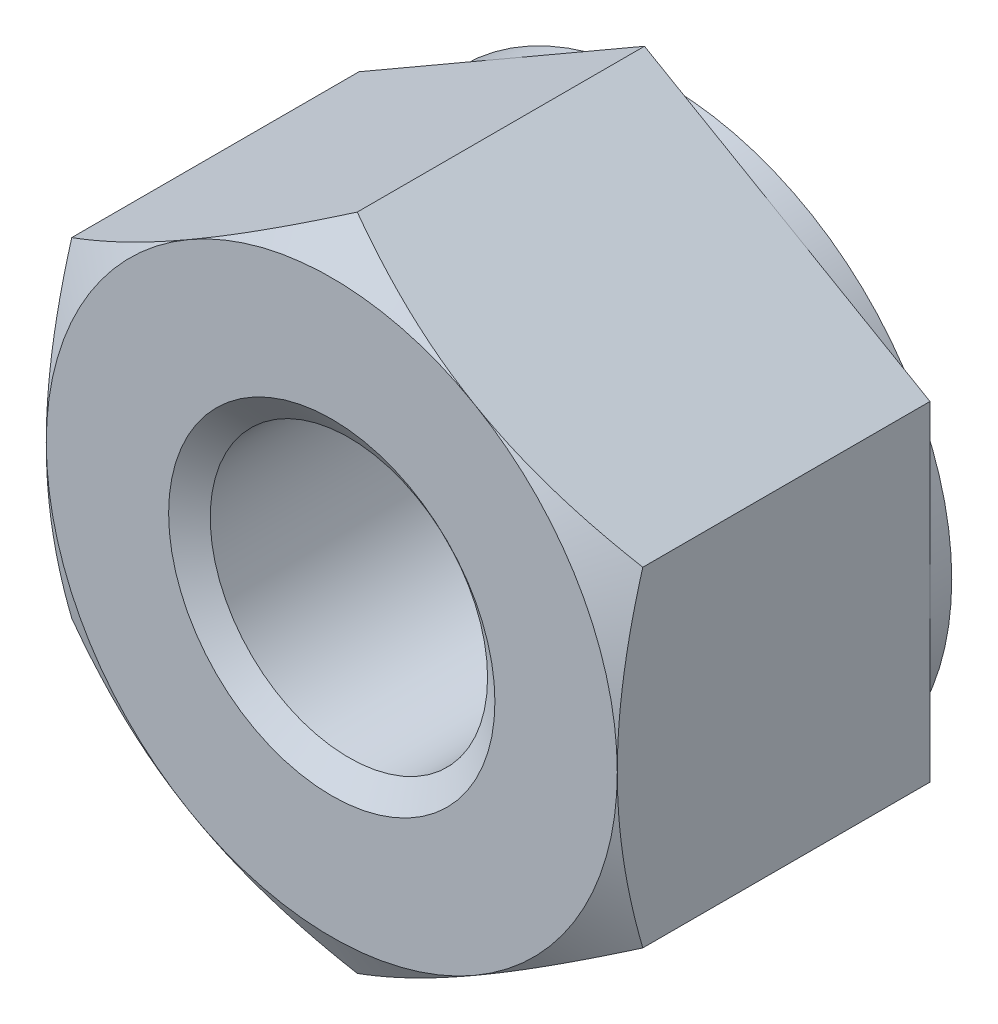
ISO-10303-21;
HEADER;
FILE_DESCRIPTION(('STEP AP214'),'2;1');
FILE_NAME('part.step','',(''),(''),'','','');
FILE_SCHEMA(('AUTOMOTIVE_DESIGN { 1 0 10303 214 1 1 1 1 }'));
ENDSEC;
DATA;
#1=APPLICATION_CONTEXT('core data for automotive mechanical design processes');
#2=APPLICATION_PROTOCOL_DEFINITION('international standard','automotive_design',2000,#1);
#3=PRODUCT_CONTEXT('',#1,'mechanical');
#4=PRODUCT('Part','Part','',(#3));
#5=PRODUCT_RELATED_PRODUCT_CATEGORY('part','',(#4));
#6=PRODUCT_DEFINITION_FORMATION('','',#4);
#7=PRODUCT_DEFINITION_CONTEXT('part definition',#1,'design');
#8=PRODUCT_DEFINITION('design','',#6,#7);
#9=PRODUCT_DEFINITION_SHAPE('','',#8);
#10=(LENGTH_UNIT() NAMED_UNIT(*) SI_UNIT(.MILLI.,.METRE.));
#11=(NAMED_UNIT(*) PLANE_ANGLE_UNIT() SI_UNIT($,.RADIAN.));
#12=(NAMED_UNIT(*) SI_UNIT($,.STERADIAN.) SOLID_ANGLE_UNIT());
#13=UNCERTAINTY_MEASURE_WITH_UNIT(LENGTH_MEASURE(1.E-05),#10,'distance_accuracy_value','');
#14=(GEOMETRIC_REPRESENTATION_CONTEXT(3) GLOBAL_UNCERTAINTY_ASSIGNED_CONTEXT((#13)) GLOBAL_UNIT_ASSIGNED_CONTEXT((#10,
#11,#12)) REPRESENTATION_CONTEXT('',''));
#15=CARTESIAN_POINT('',(0.,0.,0.));
#16=DIRECTION('',(0.,0.,1.));
#17=DIRECTION('',(1.,0.,0.));
#18=AXIS2_PLACEMENT_3D('',#15,#16,#17);
#19=CARTESIAN_POINT('',(0.,22.1243556529822,-11.5));
#20=DIRECTION('',(0.,0.,-1.));
#21=DIRECTION('',(-1.,0.,0.));
#22=AXIS2_PLACEMENT_3D('',#19,#20,#21);
#23=PLANE('',#22);
#24=CARTESIAN_POINT('',(0.,0.,-11.5));
#25=DIRECTION('',(0.,0.,1.));
#26=DIRECTION('',(1.,0.,0.));
#27=AXIS2_PLACEMENT_3D('',#24,#25,#26);
#28=CIRCLE('',#27,10.5);
#29=CARTESIAN_POINT('',(5.25000000000003,9.09326673973659,-11.5));
#30=VERTEX_POINT('',#29);
#31=CARTESIAN_POINT('',(10.5,0.,-11.5));
#32=VERTEX_POINT('',#31);
#33=EDGE_CURVE('E87',#30,#32,#28,.F.);
#34=ORIENTED_EDGE('',*,*,#33,.F.);
#35=DIRECTION('',(-0.866025403784437,0.500000000000003,0.));
#36=VECTOR('',#35,1.);
#37=CARTESIAN_POINT('',(10.5,6.06217782649105,-11.5));
#38=LINE('',#37,#36);
#39=CARTESIAN_POINT('',(10.5,6.06217782649108,-11.5));
#40=VERTEX_POINT('',#39);
#41=EDGE_CURVE('E364',#40,#30,#38,.T.);
#42=ORIENTED_EDGE('',*,*,#41,.F.);
#43=DIRECTION('',(0.,1.,0.));
#44=VECTOR('',#43,1.);
#45=CARTESIAN_POINT('',(10.5,6.06217782649105,-11.5));
#46=LINE('',#45,#44);
#47=EDGE_CURVE('E130',#40,#32,#46,.F.);
#48=ORIENTED_EDGE('',*,*,#47,.T.);
#49=EDGE_LOOP('',(#34,#42,#48));
#50=FACE_BOUND('',#49,.T.);
#51=ADVANCED_FACE('F17',(#50),#23,.T.);
#52=CARTESIAN_POINT('',(0.,22.1243556529822,-11.5));
#53=DIRECTION('',(0.,0.,-1.));
#54=DIRECTION('',(-1.,0.,0.));
#55=AXIS2_PLACEMENT_3D('',#52,#53,#54);
#56=PLANE('',#55);
#57=DIRECTION('',(-0.866025403784437,-0.500000000000003,0.));
#58=VECTOR('',#57,1.);
#59=CARTESIAN_POINT('',(0.,12.1243556529822,-11.5));
#60=LINE('',#59,#58);
#61=CARTESIAN_POINT('',(0.,12.1243556529822,-11.5));
#62=VERTEX_POINT('',#61);
#63=CARTESIAN_POINT('',(-5.25000000000003,9.09326673973659,-11.5));
#64=VERTEX_POINT('',#63);
#65=EDGE_CURVE('E343',#62,#64,#60,.T.);
#66=ORIENTED_EDGE('',*,*,#65,.F.);
#67=DIRECTION('',(-0.866025403784437,0.500000000000003,0.));
#68=VECTOR('',#67,1.);
#69=CARTESIAN_POINT('',(10.5,6.06217782649105,-11.5));
#70=LINE('',#69,#68);
#71=EDGE_CURVE('E345',#30,#62,#70,.T.);
#72=ORIENTED_EDGE('',*,*,#71,.F.);
#73=CARTESIAN_POINT('',(0.,0.,-11.5));
#74=DIRECTION('',(0.,0.,1.));
#75=DIRECTION('',(1.,0.,0.));
#76=AXIS2_PLACEMENT_3D('',#73,#74,#75);
#77=CIRCLE('',#76,10.5);
#78=EDGE_CURVE('E127',#64,#30,#77,.F.);
#79=ORIENTED_EDGE('',*,*,#78,.F.);
#80=EDGE_LOOP('',(#66,#72,#79));
#81=FACE_BOUND('',#80,.T.);
#82=ADVANCED_FACE('F330',(#81),#56,.T.);
#83=CARTESIAN_POINT('',(0.,22.1243556529822,-11.5));
#84=DIRECTION('',(0.,0.,-1.));
#85=DIRECTION('',(-1.,0.,0.));
#86=AXIS2_PLACEMENT_3D('',#83,#84,#85);
#87=PLANE('',#86);
#88=DIRECTION('',(0.,1.,0.));
#89=VECTOR('',#88,1.);
#90=CARTESIAN_POINT('',(-10.5,6.06217782649105,-11.5));
#91=LINE('',#90,#89);
#92=CARTESIAN_POINT('',(-10.5,6.06217782649105,-11.5));
#93=VERTEX_POINT('',#92);
#94=CARTESIAN_POINT('',(-10.5,0.,-11.5));
#95=VERTEX_POINT('',#94);
#96=EDGE_CURVE('E391',#93,#95,#91,.F.);
#97=ORIENTED_EDGE('',*,*,#96,.F.);
#98=DIRECTION('',(-0.866025403784437,-0.500000000000003,0.));
#99=VECTOR('',#98,1.);
#100=CARTESIAN_POINT('',(0.,12.1243556529822,-11.5));
#101=LINE('',#100,#99);
#102=EDGE_CURVE('E352',#64,#93,#101,.T.);
#103=ORIENTED_EDGE('',*,*,#102,.F.);
#104=CARTESIAN_POINT('',(0.,0.,-11.5));
#105=DIRECTION('',(0.,0.,1.));
#106=DIRECTION('',(1.,0.,0.));
#107=AXIS2_PLACEMENT_3D('',#104,#105,#106);
#108=CIRCLE('',#107,10.5);
#109=EDGE_CURVE('E123',#95,#64,#108,.F.);
#110=ORIENTED_EDGE('',*,*,#109,.F.);
#111=EDGE_LOOP('',(#97,#103,#110));
#112=FACE_BOUND('',#111,.T.);
#113=ADVANCED_FACE('F327',(#112),#87,.T.);
#114=CARTESIAN_POINT('',(0.,22.1243556529822,-11.5));
#115=DIRECTION('',(0.,0.,-1.));
#116=DIRECTION('',(-1.,0.,0.));
#117=AXIS2_PLACEMENT_3D('',#114,#115,#116);
#118=PLANE('',#117);
#119=CARTESIAN_POINT('',(0.,0.,-11.5));
#120=DIRECTION('',(0.,0.,1.));
#121=DIRECTION('',(1.,0.,0.));
#122=AXIS2_PLACEMENT_3D('',#119,#120,#121);
#123=CIRCLE('',#122,10.5);
#124=CARTESIAN_POINT('',(-5.25000000000005,-9.09326673973662,-11.5));
#125=VERTEX_POINT('',#124);
#126=EDGE_CURVE('E122',#125,#95,#123,.F.);
#127=ORIENTED_EDGE('',*,*,#126,.F.);
#128=DIRECTION('',(0.866025403784437,-0.500000000000003,0.));
#129=VECTOR('',#128,1.);
#130=CARTESIAN_POINT('',(-10.5,-6.06217782649112,-11.5));
#131=LINE('',#130,#129);
#132=CARTESIAN_POINT('',(-10.5,-6.06217782649112,-11.5));
#133=VERTEX_POINT('',#132);
#134=EDGE_CURVE('E383',#133,#125,#131,.T.);
#135=ORIENTED_EDGE('',*,*,#134,.F.);
#136=DIRECTION('',(0.,1.,0.));
#137=VECTOR('',#136,1.);
#138=CARTESIAN_POINT('',(-10.5,6.06217782649105,-11.5));
#139=LINE('',#138,#137);
#140=EDGE_CURVE('E388',#95,#133,#139,.F.);
#141=ORIENTED_EDGE('',*,*,#140,.F.);
#142=EDGE_LOOP('',(#127,#135,#141));
#143=FACE_BOUND('',#142,.T.);
#144=ADVANCED_FACE('F324',(#143),#118,.T.);
#145=CARTESIAN_POINT('',(0.,22.1243556529822,-11.5));
#146=DIRECTION('',(0.,0.,-1.));
#147=DIRECTION('',(-1.,0.,0.));
#148=AXIS2_PLACEMENT_3D('',#145,#146,#147);
#149=PLANE('',#148);
#150=CARTESIAN_POINT('',(0.,0.,-11.5));
#151=DIRECTION('',(0.,0.,1.));
#152=DIRECTION('',(1.,0.,0.));
#153=AXIS2_PLACEMENT_3D('',#150,#151,#152);
#154=CIRCLE('',#153,10.5);
#155=CARTESIAN_POINT('',(5.25000000000005,-9.09326673973662,-11.5));
#156=VERTEX_POINT('',#155);
#157=EDGE_CURVE('E94',#156,#125,#154,.F.);
#158=ORIENTED_EDGE('',*,*,#157,.F.);
#159=DIRECTION('',(0.866025403784437,0.500000000000003,0.));
#160=VECTOR('',#159,1.);
#161=CARTESIAN_POINT('',(0.,-12.1243556529822,-11.5));
#162=LINE('',#161,#160);
#163=CARTESIAN_POINT('',(0.,-12.1243556529823,-11.5));
#164=VERTEX_POINT('',#163);
#165=EDGE_CURVE('E108',#164,#156,#162,.T.);
#166=ORIENTED_EDGE('',*,*,#165,.F.);
#167=DIRECTION('',(0.866025403784437,-0.500000000000003,0.));
#168=VECTOR('',#167,1.);
#169=CARTESIAN_POINT('',(-10.5,-6.06217782649112,-11.5));
#170=LINE('',#169,#168);
#171=EDGE_CURVE('E120',#125,#164,#170,.T.);
#172=ORIENTED_EDGE('',*,*,#171,.F.);
#173=EDGE_LOOP('',(#158,#166,#172));
#174=FACE_BOUND('',#173,.T.);
#175=ADVANCED_FACE('F118',(#174),#149,.T.);
#176=CARTESIAN_POINT('',(0.,22.1243556529822,-11.5));
#177=DIRECTION('',(0.,0.,-1.));
#178=DIRECTION('',(-1.,0.,0.));
#179=AXIS2_PLACEMENT_3D('',#176,#177,#178);
#180=PLANE('',#179);
#181=DIRECTION('',(0.866025403784437,0.500000000000003,0.));
#182=VECTOR('',#181,1.);
#183=CARTESIAN_POINT('',(0.,-12.1243556529822,-11.5));
#184=LINE('',#183,#182);
#185=CARTESIAN_POINT('',(10.5,-6.06217782649112,-11.5));
#186=VERTEX_POINT('',#185);
#187=EDGE_CURVE('E99',#156,#186,#184,.T.);
#188=ORIENTED_EDGE('',*,*,#187,.F.);
#189=CARTESIAN_POINT('',(0.,0.,-11.5));
#190=DIRECTION('',(0.,0.,1.));
#191=DIRECTION('',(1.,0.,0.));
#192=AXIS2_PLACEMENT_3D('',#189,#190,#191);
#193=CIRCLE('',#192,10.5);
#194=EDGE_CURVE('E20',#32,#156,#193,.F.);
#195=ORIENTED_EDGE('',*,*,#194,.F.);
#196=DIRECTION('',(0.,1.,0.));
#197=VECTOR('',#196,1.);
#198=CARTESIAN_POINT('',(10.5,6.06217782649105,-11.5));
#199=LINE('',#198,#197);
#200=EDGE_CURVE('E104',#32,#186,#199,.F.);
#201=ORIENTED_EDGE('',*,*,#200,.T.);
#202=EDGE_LOOP('',(#188,#195,#201));
#203=FACE_BOUND('',#202,.T.);
#204=ADVANCED_FACE('F101',(#203),#180,.T.);
#205=CARTESIAN_POINT('',(0.,0.,0.));
#206=DIRECTION('',(0.,0.,1.));
#207=DIRECTION('',(1.,0.,0.));
#208=AXIS2_PLACEMENT_3D('',#205,#206,#207);
#209=CYLINDRICAL_SURFACE('',#208,10.5);
#210=ORIENTED_EDGE('',*,*,#78,.T.);
#211=ORIENTED_EDGE('',*,*,#33,.T.);
#212=ORIENTED_EDGE('',*,*,#194,.T.);
#213=ORIENTED_EDGE('',*,*,#157,.T.);
#214=ORIENTED_EDGE('',*,*,#126,.T.);
#215=ORIENTED_EDGE('',*,*,#109,.T.);
#216=EDGE_LOOP('',(#210,#211,#212,#213,#214,#215));
#217=FACE_BOUND('',#216,.T.);
#218=CARTESIAN_POINT('',(0.,0.,-12.3));
#219=DIRECTION('',(0.,0.,1.));
#220=DIRECTION('',(1.,0.,0.));
#221=AXIS2_PLACEMENT_3D('',#218,#219,#220);
#222=CIRCLE('',#221,10.5);
#223=CARTESIAN_POINT('',(10.5,0.,-12.3));
#224=VERTEX_POINT('',#223);
#225=EDGE_CURVE('E107',#224,#224,#222,.T.);
#226=ORIENTED_EDGE('',*,*,#225,.T.);
#227=EDGE_LOOP('',(#226));
#228=FACE_BOUND('',#227,.T.);
#229=ADVANCED_FACE('F91',(#217,#228),#209,.T.);
#230=CARTESIAN_POINT('',(10.5,6.06217782649105,-12.3));
#231=DIRECTION('',(-1.,0.,0.));
#232=DIRECTION('',(0.,0.,1.));
#233=AXIS2_PLACEMENT_3D('',#230,#231,#232);
#234=PLANE('',#233);
#235=DIRECTION('',(0.,0.,1.));
#236=VECTOR('',#235,1.);
#237=CARTESIAN_POINT('',(10.5,-6.06217782649112,-12.3));
#238=LINE('',#237,#236);
#239=CARTESIAN_POINT('',(10.5000000141308,-6.06217781833273,-0.937822180810799));
#240=VERTEX_POINT('',#239);
#241=EDGE_CURVE('E415',#186,#240,#238,.T.);
#242=ORIENTED_EDGE('',*,*,#241,.F.);
#243=ORIENTED_EDGE('',*,*,#200,.F.);
#244=ORIENTED_EDGE('',*,*,#47,.F.);
#245=DIRECTION('',(0.,0.,1.));
#246=VECTOR('',#245,1.);
#247=CARTESIAN_POINT('',(10.5,6.06217782649106,-12.3));
#248=LINE('',#247,#246);
#249=CARTESIAN_POINT('',(10.5,6.06217778282534,-0.937822163495314));
#250=VERTEX_POINT('',#249);
#251=EDGE_CURVE('E368',#250,#40,#248,.F.);
#252=ORIENTED_EDGE('',*,*,#251,.F.);
#253=CARTESIAN_POINT('',(10.5,0.,0.));
#254=CARTESIAN_POINT('',(10.5,0.2573053415855,4.3180546766502E-05));
#255=CARTESIAN_POINT('',(10.5,0.514598430492421,-0.00545942613173706));
#256=CARTESIAN_POINT('',(10.5,1.02867940975207,-0.0272364593957545));
#257=CARTESIAN_POINT('',(10.5,1.28546739002638,-0.0435087535011609));
#258=CARTESIAN_POINT('',(10.5,1.79687922123455,-0.0863982575084601));
#259=CARTESIAN_POINT('',(10.5,2.05150747513537,-0.112963388756823));
#260=CARTESIAN_POINT('',(10.5,2.55955197649249,-0.175871111296905));
#261=CARTESIAN_POINT('',(10.5,2.81296819186829,-0.212213959945566));
#262=CARTESIAN_POINT('',(10.5,3.31802004073705,-0.293936008682098));
#263=CARTESIAN_POINT('',(10.5,3.56965745147566,-0.339304270228194));
#264=CARTESIAN_POINT('',(10.5,4.07129355646224,-0.438331298687667));
#265=CARTESIAN_POINT('',(10.5,4.32129214987654,-0.491990570833481));
#266=CARTESIAN_POINT('',(10.5,5.07118387807468,-0.664785842113199));
#267=CARTESIAN_POINT('',(10.5,5.56849252099098,-0.795323180471177));
#268=CARTESIAN_POINT('',(10.5,6.06217773924323,-0.93782215091425));
#269=B_SPLINE_CURVE_WITH_KNOTS('',3,(#253,#254,#255,#256,#257,#258,#259,#260,#261,#262,#263,
#264,#265,#266,#267,#268),.UNSPECIFIED.,.F.,.F.,(4,2,2,2,2,2,2,4),(0.,0.771837534474387,
1.5435222849452,2.31135248440984,3.07920289572547,3.84612830249875,4.61310046213946,
6.15457742212395),.UNSPECIFIED.);
#270=CARTESIAN_POINT('',(10.5,0.,0.));
#271=VERTEX_POINT('',#270);
#272=EDGE_CURVE('E443',#271,#250,#269,.T.);
#273=ORIENTED_EDGE('',*,*,#272,.F.);
#274=CARTESIAN_POINT('',(10.5000000004793,-6.06217773924327,-0.937822150600452));
#275=CARTESIAN_POINT('',(10.5000000001177,-5.56849252094334,-0.795323180381678));
#276=CARTESIAN_POINT('',(10.5000000000215,-5.07118387802157,-0.664785842086106));
#277=CARTESIAN_POINT('',(10.4999999999893,-4.32129214983151,-0.491990570830493));
#278=CARTESIAN_POINT('',(10.4999999999971,-4.07129355642171,-0.438331298681078));
#279=CARTESIAN_POINT('',(10.5000000000029,-3.56965745144318,-0.339304270220368));
#280=CARTESIAN_POINT('',(10.5000000000008,-3.3180200407081,-0.293936008676617));
#281=CARTESIAN_POINT('',(10.4999999999992,-2.81296819184435,-0.21221395994249));
#282=CARTESIAN_POINT('',(10.4999999999998,-2.55955197647001,-0.175871111293979));
#283=CARTESIAN_POINT('',(10.5000000000002,-2.05150747511533,-0.112963388754485));
#284=CARTESIAN_POINT('',(10.5000000000001,-1.79687922121547,-0.0863982575065776));
#285=CARTESIAN_POINT('',(10.4999999999999,-1.28546739001095,-0.0435087535001499));
#286=CARTESIAN_POINT('',(10.5,-1.02867940973932,-0.0272364593950914));
#287=CARTESIAN_POINT('',(10.5,-0.514598430485708,-0.0054594261315764));
#288=CARTESIAN_POINT('',(10.5000000000001,-0.25730534158215,4.31805468005819E-05));
#289=CARTESIAN_POINT('',(10.5,0.,0.));
#290=B_SPLINE_CURVE_WITH_KNOTS('',3,(#274,#275,#276,#277,#278,#279,#280,#281,#282,#283,#284,
#285,#286,#287,#288,#289),.UNSPECIFIED.,.F.,.F.,(4,2,2,2,2,2,2,4),(0.,1.54147695995325,
2.30844911958364,3.07537452634494,3.84322493765628,4.61105513711786,5.3827398875806,
6.15457742204491),.UNSPECIFIED.);
#291=EDGE_CURVE('E133',#240,#271,#290,.T.);
#292=ORIENTED_EDGE('',*,*,#291,.F.);
#293=EDGE_LOOP('',(#242,#243,#244,#252,#273,#292));
#294=FACE_BOUND('',#293,.T.);
#295=ADVANCED_FACE('F146',(#294),#234,.F.);
#296=CARTESIAN_POINT('',(10.5,6.06217782649105,-12.3));
#297=DIRECTION('',(0.500000000000003,0.866025403784437,0.));
#298=DIRECTION('',(-0.866025403784437,0.500000000000003,0.));
#299=AXIS2_PLACEMENT_3D('',#296,#297,#298);
#300=PLANE('',#299);
#301=ORIENTED_EDGE('',*,*,#41,.T.);
#302=ORIENTED_EDGE('',*,*,#71,.T.);
#303=DIRECTION('',(0.,0.,1.));
#304=VECTOR('',#303,1.);
#305=CARTESIAN_POINT('',(0.,12.1243556529822,-12.3));
#306=LINE('',#305,#304);
#307=CARTESIAN_POINT('',(3.78156402024653E-08,12.1243556311493,-0.937822163495333));
#308=VERTEX_POINT('',#307);
#309=EDGE_CURVE('E353',#308,#62,#306,.F.);
#310=ORIENTED_EDGE('',*,*,#309,.F.);
#311=CARTESIAN_POINT('',(5.25000000000003,9.09326673973659,0.));
#312=CARTESIAN_POINT('',(5.02716703765755,9.22191941052934,4.31805467655264E-05));
#313=CARTESIAN_POINT('',(4.80434468644599,9.35056595498281,-0.00545942613173802));
#314=CARTESIAN_POINT('',(4.35913749880475,9.60760644461263,-0.0272364593957552));
#315=CARTESIAN_POINT('',(4.1367525845007,9.73600043474979,-0.0435087535011614));
#316=CARTESIAN_POINT('',(3.69385694687851,9.99170635035387,-0.0863982575084612));
#317=CARTESIAN_POINT('',(3.47334241047912,10.1190204773043,-0.112963388756825));
#318=CARTESIAN_POINT('',(3.03336296605086,10.3730427279828,-0.175871111296908));
#319=CARTESIAN_POINT('',(2.81389808580451,10.4997508356707,-0.212213959945568));
#320=CARTESIAN_POINT('',(2.37651035445586,10.7522767601051,-0.293936008682101));
#321=CARTESIAN_POINT('',(2.15858596421368,10.8780954654744,-0.339304270228198));
#322=CARTESIAN_POINT('',(1.72415635383983,11.1289135179677,-0.438331298687671));
#323=CARTESIAN_POINT('',(1.50765122103266,11.2539128146749,-0.491990570833486));
#324=CARTESIAN_POINT('',(0.85822593432526,11.628858678774,-0.664785842113205));
#325=CARTESIAN_POINT('',(0.427544016038181,11.8775130002321,-0.795323180471184));
#326=CARTESIAN_POINT('',(7.55588658482082E-08,12.1243556093582,-0.937822150914259));
#327=B_SPLINE_CURVE_WITH_KNOTS('',3,(#311,#312,#313,#314,#315,#316,#317,#318,#319,#320,#321,
#322,#323,#324,#325,#326),.UNSPECIFIED.,.F.,.F.,(4,2,2,2,2,2,2,4),(0.,0.77183753447439,
1.54352228494521,2.31135248440985,3.07920289572548,3.84612830249877,4.61310046213948,
6.15457742212398),.UNSPECIFIED.);
#328=CARTESIAN_POINT('',(5.25000000000003,9.09326673973659,0.));
#329=VERTEX_POINT('',#328);
#330=EDGE_CURVE('E233',#329,#308,#327,.T.);
#331=ORIENTED_EDGE('',*,*,#330,.F.);
#332=CARTESIAN_POINT('',(10.5000000041469,6.06217778132959,-0.93782220790423));
#333=CARTESIAN_POINT('',(10.0724560730786,6.30902041728449,-0.795323215553693));
#334=CARTESIAN_POINT('',(9.64177415101793,6.55767474950975,-0.664785868019314));
#335=CARTESIAN_POINT('',(8.99234885308478,6.93262062296021,-0.491990588962645));
#336=CARTESIAN_POINT('',(8.77584371569879,7.05761992161287,-0.438331315233156));
#337=CARTESIAN_POINT('',(8.34141409655094,7.30843797866079,-0.339304283385243));
#338=CARTESIAN_POINT('',(8.12348970211333,7.43425668663932,-0.293936020035769));
#339=CARTESIAN_POINT('',(7.686101962325,7.68678261608349,-0.212213968153186));
#340=CARTESIAN_POINT('',(7.46663707783506,7.81349072617129,-0.175871118155983));
#341=CARTESIAN_POINT('',(7.02665762492507,8.06751298170983,-0.112963393234373));
#342=CARTESIAN_POINT('',(6.80614308428768,8.19482711112025,-0.08639826095178));
#343=CARTESIAN_POINT('',(6.36324743797566,8.45053303175201,-0.0435087552512121));
#344=CARTESIAN_POINT('',(6.14086251921905,8.5789270244572,-0.0272364604953518));
#345=CARTESIAN_POINT('',(5.69565532260047,8.83596751926478,-0.00545942635481625));
#346=CARTESIAN_POINT('',(5.47283296686403,8.96461406632802,4.31805473506373E-05));
#347=CARTESIAN_POINT('',(5.25000000000003,9.09326673973659,0.));
#348=B_SPLINE_CURVE_WITH_KNOTS('',3,(#332,#333,#334,#335,#336,#337,#338,#339,#340,#341,#342,
#343,#344,#345,#346,#347),.UNSPECIFIED.,.F.,.F.,(4,2,2,2,2,2,2,4),(0.,1.54147699200857,
2.30844916707764,3.07537458940569,3.84322501575467,4.61105523015517,5.38273999612459,
6.15457754626661),.UNSPECIFIED.);
#349=EDGE_CURVE('E439',#250,#329,#348,.T.);
#350=ORIENTED_EDGE('',*,*,#349,.F.);
#351=ORIENTED_EDGE('',*,*,#251,.T.);
#352=EDGE_LOOP('',(#301,#302,#310,#331,#350,#351));
#353=FACE_BOUND('',#352,.T.);
#354=ADVANCED_FACE('F318',(#353),#300,.T.);
#355=CARTESIAN_POINT('',(0.,12.1243556529822,-12.3));
#356=DIRECTION('',(-0.500000000000003,0.866025403784437,0.));
#357=DIRECTION('',(-0.866025403784437,-0.500000000000003,0.));
#358=AXIS2_PLACEMENT_3D('',#355,#356,#357);
#359=PLANE('',#358);
#360=ORIENTED_EDGE('',*,*,#65,.T.);
#361=ORIENTED_EDGE('',*,*,#102,.T.);
#362=DIRECTION('',(0.,0.,1.));
#363=VECTOR('',#362,1.);
#364=CARTESIAN_POINT('',(-10.5,6.06217782649105,-12.3));
#365=LINE('',#364,#363);
#366=CARTESIAN_POINT('',(-10.5000000141308,6.06217781833265,-0.937822180810777));
#367=VERTEX_POINT('',#366);
#368=EDGE_CURVE('E355',#367,#93,#365,.F.);
#369=ORIENTED_EDGE('',*,*,#368,.F.);
#370=CARTESIAN_POINT('',(-5.25000000000003,9.09326673973659,0.));
#371=CARTESIAN_POINT('',(-5.47283296664209,8.96461406646147,4.31805499926728E-05));
#372=CARTESIAN_POINT('',(-5.69565532215222,8.83596751952623,-0.00545942634239283));
#373=CARTESIAN_POINT('',(-6.14086251836396,8.57892702494823,-0.027236460444095));
#374=CARTESIAN_POINT('',(-6.36324743693994,8.45053303234467,-0.0435087551730621));
#375=CARTESIAN_POINT('',(-6.80614308301272,8.19482711186163,-0.0863982608062398));
#376=CARTESIAN_POINT('',(-7.02665762359107,8.06751298249849,-0.112963393053632));
#377=CARTESIAN_POINT('',(-7.46663707632205,7.81349072702635,-0.175871117929668));
#378=CARTESIAN_POINT('',(-7.68610196069216,7.68678261695761,-0.21221396791529));
#379=CARTESIAN_POINT('',(-8.12348970020402,7.43425668781019,-0.293936019611922));
#380=CARTESIAN_POINT('',(-8.34141409448584,7.30843798010859,-0.339304282780156));
#381=CARTESIAN_POINT('',(-8.77584371287409,7.05761992298819,-0.438331314723622));
#382=CARTESIAN_POINT('',(-8.99234884965601,6.93262062398621,-0.491990588731326));
#383=CARTESIAN_POINT('',(-9.6417741482912,6.55767475300062,-0.664785865925144));
#384=CARTESIAN_POINT('',(-10.0724560744369,6.30902042700531,-0.795323208637138));
#385=CARTESIAN_POINT('',(-10.5000000226657,6.062177813405,-0.93782218365576));
#386=B_SPLINE_CURVE_WITH_KNOTS('',3,(#370,#371,#372,#373,#374,#375,#376,#377,#378,#379,#380,
#381,#382,#383,#384,#385),.UNSPECIFIED.,.F.,.F.,(4,2,2,2,2,2,2,4),(0.,0.771837549363267,
1.54352231470848,2.31135252887181,3.07920295488873,3.84612837629034,4.61310055056201,
6.15457754015559),.UNSPECIFIED.);
#387=CARTESIAN_POINT('',(-5.25000000000003,9.09326673973659,0.));
#388=VERTEX_POINT('',#387);
#389=EDGE_CURVE('E210',#388,#367,#386,.T.);
#390=ORIENTED_EDGE('',*,*,#389,.F.);
#391=CARTESIAN_POINT('',(4.11844570895324E-08,12.1243556339928,-0.937822207904265));
#392=CARTESIAN_POINT('',(-0.427543917823752,11.8775130464312,-0.795323215553722));
#393=CARTESIAN_POINT('',(-0.858225847322246,11.6288587270886,-0.664785868019336));
#394=CARTESIAN_POINT('',(-1.50765114774108,11.2539128579434,-0.491990588962659));
#395=CARTESIAN_POINT('',(-1.72415628452251,11.1289135582436,-0.438331315233168));
#396=CARTESIAN_POINT('',(-2.15858590322779,10.8780955004291,-0.339304283385252));
#397=CARTESIAN_POINT('',(-2.37651029782734,10.7522767927311,-0.293936020035779));
#398=CARTESIAN_POINT('',(-2.81389803773445,10.4997508634926,-0.212213968153194));
#399=CARTESIAN_POINT('',(-3.03336292218097,10.3730427533296,-0.175871118155989));
#400=CARTESIAN_POINT('',(-3.47334237505896,10.1190204977356,-0.112963393234376));
#401=CARTESIAN_POINT('',(-3.69385691570778,9.99170636834501,-0.0863982609517823));
#402=CARTESIAN_POINT('',(-4.13675256202899,9.73600044772915,-0.0435087552512133));
#403=CARTESIAN_POINT('',(-4.3591374807833,9.60760645501998,-0.0272364604953529));
#404=CARTESIAN_POINT('',(-4.80434467739729,9.35056596020442,-0.00545942635481708));
#405=CARTESIAN_POINT('',(-5.02716703313142,9.22191941313719,4.3180547350049E-05));
#406=CARTESIAN_POINT('',(-5.25000000000003,9.09326673973659,0.));
#407=B_SPLINE_CURVE_WITH_KNOTS('',3,(#391,#392,#393,#394,#395,#396,#397,#398,#399,#400,#401,
#402,#403,#404,#405,#406),.UNSPECIFIED.,.F.,.F.,(4,2,2,2,2,2,2,4),(0.,1.54147699200859,
2.30844916707768,3.07537458940574,3.84322501575473,4.61105523015524,5.38273999612468,
6.1545775462667),.UNSPECIFIED.);
#408=EDGE_CURVE('E228',#308,#388,#407,.T.);
#409=ORIENTED_EDGE('',*,*,#408,.F.);
#410=ORIENTED_EDGE('',*,*,#309,.T.);
#411=EDGE_LOOP('',(#360,#361,#369,#390,#409,#410));
#412=FACE_BOUND('',#411,.T.);
#413=ADVANCED_FACE('F219',(#412),#359,.T.);
#414=CARTESIAN_POINT('',(-10.5,6.06217782649105,-12.3));
#415=DIRECTION('',(-1.,0.,0.));
#416=DIRECTION('',(0.,0.,1.));
#417=AXIS2_PLACEMENT_3D('',#414,#415,#416);
#418=PLANE('',#417);
#419=ORIENTED_EDGE('',*,*,#96,.T.);
#420=ORIENTED_EDGE('',*,*,#140,.T.);
#421=DIRECTION('',(0.,0.,1.));
#422=VECTOR('',#421,1.);
#423=CARTESIAN_POINT('',(-10.5,-6.06217782649112,-12.3));
#424=LINE('',#423,#422);
#425=CARTESIAN_POINT('',(-10.5,-6.06217778282538,-0.937822163495334));
#426=VERTEX_POINT('',#425);
#427=EDGE_CURVE('E385',#426,#133,#424,.F.);
#428=ORIENTED_EDGE('',*,*,#427,.F.);
#429=CARTESIAN_POINT('',(-10.5,0.,0.));
#430=CARTESIAN_POINT('',(-10.5,-0.257305341585501,4.3180546766401E-05));
#431=CARTESIAN_POINT('',(-10.5,-0.514598430492423,-0.0054594261317371));
#432=CARTESIAN_POINT('',(-10.5,-1.02867940975207,-0.0272364593957544));
#433=CARTESIAN_POINT('',(-10.5,-1.28546739002639,-0.0435087535011608));
#434=CARTESIAN_POINT('',(-10.5,-1.79687922123455,-0.0863982575084603));
#435=CARTESIAN_POINT('',(-10.5,-2.05150747513538,-0.112963388756823));
#436=CARTESIAN_POINT('',(-10.5,-2.5595519764925,-0.175871111296906));
#437=CARTESIAN_POINT('',(-10.5,-2.8129681918683,-0.212213959945567));
#438=CARTESIAN_POINT('',(-10.5,-3.31802004073707,-0.2939360086821));
#439=CARTESIAN_POINT('',(-10.5,-3.56965745147568,-0.339304270228196));
#440=CARTESIAN_POINT('',(-10.5,-4.07129355646225,-0.438331298687669));
#441=CARTESIAN_POINT('',(-10.5,-4.32129214987656,-0.491990570833484));
#442=CARTESIAN_POINT('',(-10.5,-5.0711838780747,-0.664785842113205));
#443=CARTESIAN_POINT('',(-10.5,-5.568492520991,-0.795323180471185));
#444=CARTESIAN_POINT('',(-10.5,-6.06217773924325,-0.937822150914257));
#445=B_SPLINE_CURVE_WITH_KNOTS('',3,(#429,#430,#431,#432,#433,#434,#435,#436,#437,#438,#439,
#440,#441,#442,#443,#444),.UNSPECIFIED.,.F.,.F.,(4,2,2,2,2,2,2,4),(0.,0.771837534474389,
1.54352228494521,2.31135248440985,3.07920289572548,3.84612830249877,4.61310046213948,
6.15457742212398),.UNSPECIFIED.);
#446=CARTESIAN_POINT('',(-10.5,0.,0.));
#447=VERTEX_POINT('',#446);
#448=EDGE_CURVE('E205',#447,#426,#445,.T.);
#449=ORIENTED_EDGE('',*,*,#448,.F.);
#450=CARTESIAN_POINT('',(-10.5000000004793,6.0621777392432,-0.937822150600434));
#451=CARTESIAN_POINT('',(-10.5000000001177,5.56849252094327,-0.795323180381659));
#452=CARTESIAN_POINT('',(-10.5000000000215,5.0711838780215,-0.66478584208609));
#453=CARTESIAN_POINT('',(-10.4999999999893,4.32129214983145,-0.491990570830482));
#454=CARTESIAN_POINT('',(-10.4999999999971,4.07129355642166,-0.438331298681068));
#455=CARTESIAN_POINT('',(-10.5000000000029,3.56965745144313,-0.33930427022036));
#456=CARTESIAN_POINT('',(-10.5000000000008,3.31802004070806,-0.29393600867661));
#457=CARTESIAN_POINT('',(-10.4999999999992,2.81296819184432,-0.212213959942485));
#458=CARTESIAN_POINT('',(-10.4999999999998,2.55955197646998,-0.175871111293974));
#459=CARTESIAN_POINT('',(-10.5000000000002,2.05150747511531,-0.112963388754482));
#460=CARTESIAN_POINT('',(-10.5000000000001,1.79687922121545,-0.0863982575065748));
#461=CARTESIAN_POINT('',(-10.4999999999999,1.28546739001093,-0.0435087535001486));
#462=CARTESIAN_POINT('',(-10.5,1.0286794097393,-0.0272364593950908));
#463=CARTESIAN_POINT('',(-10.5,0.514598430485701,-0.00545942613157678));
#464=CARTESIAN_POINT('',(-10.5000000000001,0.257305341582147,4.31805468000881E-05));
#465=CARTESIAN_POINT('',(-10.5,0.,0.));
#466=B_SPLINE_CURVE_WITH_KNOTS('',3,(#450,#451,#452,#453,#454,#455,#456,#457,#458,#459,#460,
#461,#462,#463,#464,#465),.UNSPECIFIED.,.F.,.F.,(4,2,2,2,2,2,2,4),(0.,1.54147695995323,
2.30844911958362,3.0753745263449,3.84322493765623,4.6110551371178,5.38273988758053,
6.15457742204484),.UNSPECIFIED.);
#467=EDGE_CURVE('E223',#367,#447,#466,.T.);
#468=ORIENTED_EDGE('',*,*,#467,.F.);
#469=ORIENTED_EDGE('',*,*,#368,.T.);
#470=EDGE_LOOP('',(#419,#420,#428,#449,#468,#469));
#471=FACE_BOUND('',#470,.T.);
#472=ADVANCED_FACE('F216',(#471),#418,.T.);
#473=CARTESIAN_POINT('',(-10.5,-6.06217782649112,-12.3));
#474=DIRECTION('',(-0.500000000000003,-0.866025403784437,0.));
#475=DIRECTION('',(0.866025403784437,-0.500000000000003,0.));
#476=AXIS2_PLACEMENT_3D('',#473,#474,#475);
#477=PLANE('',#476);
#478=ORIENTED_EDGE('',*,*,#134,.T.);
#479=ORIENTED_EDGE('',*,*,#171,.T.);
#480=DIRECTION('',(0.,0.,1.));
#481=VECTOR('',#480,1.);
#482=CARTESIAN_POINT('',(0.,-12.1243556529823,-12.3));
#483=LINE('',#482,#481);
#484=CARTESIAN_POINT('',(-3.78157248753041E-08,-12.1243556311494,-0.937822163495373));
#485=VERTEX_POINT('',#484);
#486=EDGE_CURVE('E115',#485,#164,#483,.F.);
#487=ORIENTED_EDGE('',*,*,#486,.F.);
#488=CARTESIAN_POINT('',(-5.25000000000006,-9.09326673973665,0.));
#489=CARTESIAN_POINT('',(-5.02716703765759,-9.2219194105294,4.31805467297049E-05));
#490=CARTESIAN_POINT('',(-4.80434468644603,-9.35056595498286,-0.00545942613177378));
#491=CARTESIAN_POINT('',(-4.35913749880479,-9.60760644461268,-0.0272364593957913));
#492=CARTESIAN_POINT('',(-4.13675258450075,-9.73600043474984,-0.043508753501198));
#493=CARTESIAN_POINT('',(-3.69385694687856,-9.99170635035392,-0.0863982575084967));
#494=CARTESIAN_POINT('',(-3.47334241047917,-10.1190204773043,-0.112963388756859));
#495=CARTESIAN_POINT('',(-3.03336296605092,-10.3730427279829,-0.17587111129694));
#496=CARTESIAN_POINT('',(-2.81389808580457,-10.4997508356708,-0.212213959945599));
#497=CARTESIAN_POINT('',(-2.37651035445592,-10.7522767601052,-0.29393600868213));
#498=CARTESIAN_POINT('',(-2.15858596421375,-10.8780954654745,-0.339304270228226));
#499=CARTESIAN_POINT('',(-1.7241563538399,-11.1289135179678,-0.438331298687697));
#500=CARTESIAN_POINT('',(-1.50765122103274,-11.2539128146749,-0.491990570833509));
#501=CARTESIAN_POINT('',(-0.858225934325343,-11.628858678774,-0.664785842113224));
#502=CARTESIAN_POINT('',(-0.427544016038271,-11.8775130002321,-0.795323180471199));
#503=CARTESIAN_POINT('',(-7.55589586298844E-08,-12.1243556093583,-0.937822150914272));
#504=B_SPLINE_CURVE_WITH_KNOTS('',3,(#488,#489,#490,#491,#492,#493,#494,#495,#496,#497,#498,
#499,#500,#501,#502,#503),.UNSPECIFIED.,.F.,.F.,(4,2,2,2,2,2,2,4),(0.,0.771837534474382,
1.54352228494519,2.31135248440982,3.07920289572545,3.84612830249872,4.61310046213942,
6.1545774221239),.UNSPECIFIED.);
#505=CARTESIAN_POINT('',(-5.25000000000004,-9.09326673973662,0.));
#506=VERTEX_POINT('',#505);
#507=EDGE_CURVE('E179',#506,#485,#504,.T.);
#508=ORIENTED_EDGE('',*,*,#507,.F.);
#509=CARTESIAN_POINT('',(-10.5000000041469,-6.06217778132964,-0.937822207904268));
#510=CARTESIAN_POINT('',(-10.0724560730787,-6.30902041728455,-0.795323215553726));
#511=CARTESIAN_POINT('',(-9.64177415101796,-6.55767474950981,-0.664785868019346));
#512=CARTESIAN_POINT('',(-8.99234885308481,-6.93262062296028,-0.491990588962677));
#513=CARTESIAN_POINT('',(-8.77584371569881,-7.05761992161293,-0.438331315233188));
#514=CARTESIAN_POINT('',(-8.34141409655096,-7.30843797866085,-0.339304283385276));
#515=CARTESIAN_POINT('',(-8.12348970211335,-7.43425668663938,-0.293936020035804));
#516=CARTESIAN_POINT('',(-7.68610196232502,-7.68678261608355,-0.212213968153222));
#517=CARTESIAN_POINT('',(-7.46663707783509,-7.81349072617135,-0.175871118156019));
#518=CARTESIAN_POINT('',(-7.0266576249251,-8.06751298170989,-0.112963393234409));
#519=CARTESIAN_POINT('',(-6.80614308428771,-8.1948271111203,-0.0863982609518161));
#520=CARTESIAN_POINT('',(-6.36324743797569,-8.45053303175207,-0.0435087552512488));
#521=CARTESIAN_POINT('',(-6.14086251921908,-8.57892702445725,-0.0272364604953893));
#522=CARTESIAN_POINT('',(-5.6956553226005,-8.83596751926484,-0.00545942635485454));
#523=CARTESIAN_POINT('',(-5.47283296686406,-8.96461406632807,4.31805473124252E-05));
#524=CARTESIAN_POINT('',(-5.25000000000006,-9.09326673973665,0.));
#525=B_SPLINE_CURVE_WITH_KNOTS('',3,(#509,#510,#511,#512,#513,#514,#515,#516,#517,#518,#519,
#520,#521,#522,#523,#524),.UNSPECIFIED.,.F.,.F.,(4,2,2,2,2,2,2,4),(0.,1.54147699200856,
2.30844916707764,3.07537458940568,3.84322501575466,4.61105523015516,5.38273999612458,
6.15457754626659),.UNSPECIFIED.);
#526=EDGE_CURVE('E35',#426,#506,#525,.T.);
#527=ORIENTED_EDGE('',*,*,#526,.F.);
#528=ORIENTED_EDGE('',*,*,#427,.T.);
#529=EDGE_LOOP('',(#478,#479,#487,#508,#527,#528));
#530=FACE_BOUND('',#529,.T.);
#531=ADVANCED_FACE('F166',(#530),#477,.T.);
#532=CARTESIAN_POINT('',(0.,-12.1243556529822,-12.3));
#533=DIRECTION('',(0.500000000000003,-0.866025403784437,0.));
#534=DIRECTION('',(0.866025403784437,0.500000000000003,0.));
#535=AXIS2_PLACEMENT_3D('',#532,#533,#534);
#536=PLANE('',#535);
#537=ORIENTED_EDGE('',*,*,#165,.T.);
#538=ORIENTED_EDGE('',*,*,#187,.T.);
#539=ORIENTED_EDGE('',*,*,#241,.T.);
#540=CARTESIAN_POINT('',(5.25000000000006,-9.09326673973665,0.));
#541=CARTESIAN_POINT('',(5.47283296664212,-8.96461406646154,4.31805499540418E-05));
#542=CARTESIAN_POINT('',(5.69565532215225,-8.83596751952629,-0.00545942634243138));
#543=CARTESIAN_POINT('',(6.14086251836398,-8.57892702494829,-0.0272364604441333));
#544=CARTESIAN_POINT('',(6.36324743693996,-8.45053303234473,-0.0435087551731003));
#545=CARTESIAN_POINT('',(6.80614308301274,-8.1948271118617,-0.086398260806277));
#546=CARTESIAN_POINT('',(7.02665762359109,-8.06751298249856,-0.112963393053669));
#547=CARTESIAN_POINT('',(7.46663707632207,-7.81349072702643,-0.175871117929702));
#548=CARTESIAN_POINT('',(7.68610196069217,-7.68678261695768,-0.212213967915323));
#549=CARTESIAN_POINT('',(8.12348970020403,-7.43425668781026,-0.293936019611954));
#550=CARTESIAN_POINT('',(8.34141409448585,-7.30843798010866,-0.339304282780187));
#551=CARTESIAN_POINT('',(8.77584371287409,-7.05761992298826,-0.438331314723652));
#552=CARTESIAN_POINT('',(8.99234884965601,-6.93262062398628,-0.491990588731355));
#553=CARTESIAN_POINT('',(9.6417741482912,-6.5576747530007,-0.664785865925169));
#554=CARTESIAN_POINT('',(10.0724560744369,-6.30902042700539,-0.795323208637159));
#555=CARTESIAN_POINT('',(10.5000000226657,-6.06217781340508,-0.937822183655781));
#556=B_SPLINE_CURVE_WITH_KNOTS('',3,(#540,#541,#542,#543,#544,#545,#546,#547,#548,#549,#550,
#551,#552,#553,#554,#555),.UNSPECIFIED.,.F.,.F.,(4,2,2,2,2,2,2,4),(0.,0.771837549363261,
1.54352231470847,2.3113525288718,3.0792029548887,3.84612837629032,4.61310055056198,
6.15457754015555),.UNSPECIFIED.);
#557=CARTESIAN_POINT('',(5.25000000000005,-9.09326673973662,0.));
#558=VERTEX_POINT('',#557);
#559=EDGE_CURVE('E140',#558,#240,#556,.T.);
#560=ORIENTED_EDGE('',*,*,#559,.F.);
#561=CARTESIAN_POINT('',(-4.11845200242657E-08,-12.1243556339929,-0.937822207904345));
#562=CARTESIAN_POINT('',(0.427543917823702,-11.8775130464313,-0.795323215553782));
#563=CARTESIAN_POINT('',(0.858225847322206,-11.6288587270887,-0.664785868019392));
#564=CARTESIAN_POINT('',(1.50765114774105,-11.2539128579435,-0.491990588962711));
#565=CARTESIAN_POINT('',(1.72415628452249,-11.1289135582437,-0.43833131523322));
#566=CARTESIAN_POINT('',(2.15858590322777,-10.8780955004292,-0.339304283385302));
#567=CARTESIAN_POINT('',(2.37651029782733,-10.7522767927312,-0.293936020035827));
#568=CARTESIAN_POINT('',(2.81389803773444,-10.4997508634927,-0.212213968153239));
#569=CARTESIAN_POINT('',(3.03336292218096,-10.3730427533297,-0.175871118156033));
#570=CARTESIAN_POINT('',(3.47334237505896,-10.1190204977357,-0.112963393234419));
#571=CARTESIAN_POINT('',(3.69385691570778,-9.99170636834509,-0.0863982609518255));
#572=CARTESIAN_POINT('',(4.13675256202899,-9.73600044772923,-0.0435087552512553));
#573=CARTESIAN_POINT('',(4.35913748078331,-9.60760645502005,-0.0272364604953937));
#574=CARTESIAN_POINT('',(4.80434467739731,-9.35056596020448,-0.00545942635485614));
#575=CARTESIAN_POINT('',(5.02716703313145,-9.22191941313725,4.31805473114142E-05));
#576=CARTESIAN_POINT('',(5.25000000000006,-9.09326673973665,0.));
#577=B_SPLINE_CURVE_WITH_KNOTS('',3,(#561,#562,#563,#564,#565,#566,#567,#568,#569,#570,#571,
#572,#573,#574,#575,#576),.UNSPECIFIED.,.F.,.F.,(4,2,2,2,2,2,2,4),(0.,1.54147699200862,
2.30844916707771,3.07537458940579,3.84322501575479,4.61105523015531,5.38273999612476,
6.1545775462668),.UNSPECIFIED.);
#578=EDGE_CURVE('E171',#485,#558,#577,.T.);
#579=ORIENTED_EDGE('',*,*,#578,.F.);
#580=ORIENTED_EDGE('',*,*,#486,.T.);
#581=EDGE_LOOP('',(#537,#538,#539,#560,#579,#580));
#582=FACE_BOUND('',#581,.T.);
#583=ADVANCED_FACE('F112',(#582),#536,.T.);
#584=CARTESIAN_POINT('',(-20.9999999999999,0.,-12.3));
#585=DIRECTION('',(0.,0.,1.));
#586=DIRECTION('',(1.,0.,0.));
#587=AXIS2_PLACEMENT_3D('',#584,#585,#586);
#588=PLANE('',#587);
#589=CARTESIAN_POINT('',(0.,0.,-12.3));
#590=DIRECTION('',(0.,0.,1.));
#591=DIRECTION('',(1.,0.,0.));
#592=AXIS2_PLACEMENT_3D('',#589,#590,#591);
#593=CIRCLE('',#592,6.);
#594=CARTESIAN_POINT('',(6.,0.,-12.3));
#595=VERTEX_POINT('',#594);
#596=EDGE_CURVE('E178',#595,#595,#593,.T.);
#597=ORIENTED_EDGE('',*,*,#596,.T.);
#598=EDGE_LOOP('',(#597));
#599=FACE_BOUND('',#598,.T.);
#600=ORIENTED_EDGE('',*,*,#225,.F.);
#601=EDGE_LOOP('',(#600));
#602=FACE_BOUND('',#601,.T.);
#603=ADVANCED_FACE('F156',(#599,#602),#588,.F.);
#604=CARTESIAN_POINT('',(0.,0.,-0.943449108505363));
#605=DIRECTION('',(0.,0.,-1.));
#606=DIRECTION('',(-1.,0.,0.));
#607=AXIS2_PLACEMENT_3D('',#604,#605,#606);
#608=CONICAL_SURFACE('',#607,12.1341017857711,1.04719755);
#609=CARTESIAN_POINT('',(0.,0.,0.));
#610=DIRECTION('',(0.,0.,-1.));
#611=DIRECTION('',(-1.,0.,0.));
#612=AXIS2_PLACEMENT_3D('',#609,#610,#611);
#613=CIRCLE('',#612,10.5);
#614=EDGE_CURVE('E306',#558,#271,#613,.F.);
#615=ORIENTED_EDGE('',*,*,#614,.F.);
#616=ORIENTED_EDGE('',*,*,#559,.T.);
#617=ORIENTED_EDGE('',*,*,#291,.T.);
#618=EDGE_LOOP('',(#615,#616,#617));
#619=FACE_BOUND('',#618,.T.);
#620=ADVANCED_FACE('F150',(#619),#608,.T.);
#621=CARTESIAN_POINT('',(0.,0.,-0.943449108505361));
#622=DIRECTION('',(0.,0.,-1.));
#623=DIRECTION('',(0.,1.,0.));
#624=AXIS2_PLACEMENT_3D('',#621,#622,#623);
#625=CONICAL_SURFACE('',#624,12.1341017857711,1.04719755);
#626=ORIENTED_EDGE('',*,*,#272,.T.);
#627=ORIENTED_EDGE('',*,*,#349,.T.);
#628=CARTESIAN_POINT('',(0.,0.,0.));
#629=DIRECTION('',(0.,0.,-1.));
#630=DIRECTION('',(0.,1.,0.));
#631=AXIS2_PLACEMENT_3D('',#628,#629,#630);
#632=CIRCLE('',#631,10.5);
#633=EDGE_CURVE('E304',#271,#329,#632,.F.);
#634=ORIENTED_EDGE('',*,*,#633,.F.);
#635=EDGE_LOOP('',(#626,#627,#634));
#636=FACE_BOUND('',#635,.T.);
#637=ADVANCED_FACE('F155',(#636),#625,.T.);
#638=CARTESIAN_POINT('',(0.,0.,-0.943449108505362));
#639=DIRECTION('',(0.,0.,-1.));
#640=DIRECTION('',(-1.,0.,0.));
#641=AXIS2_PLACEMENT_3D('',#638,#639,#640);
#642=CONICAL_SURFACE('',#641,12.1341017857711,1.04719755);
#643=ORIENTED_EDGE('',*,*,#330,.T.);
#644=ORIENTED_EDGE('',*,*,#408,.T.);
#645=CARTESIAN_POINT('',(0.,0.,0.));
#646=DIRECTION('',(0.,0.,-1.));
#647=DIRECTION('',(-1.,0.,0.));
#648=AXIS2_PLACEMENT_3D('',#645,#646,#647);
#649=CIRCLE('',#648,10.5);
#650=EDGE_CURVE('E302',#329,#388,#649,.F.);
#651=ORIENTED_EDGE('',*,*,#650,.F.);
#652=EDGE_LOOP('',(#643,#644,#651));
#653=FACE_BOUND('',#652,.T.);
#654=ADVANCED_FACE('F238',(#653),#642,.T.);
#655=CARTESIAN_POINT('',(0.,0.,-0.943449108505347));
#656=DIRECTION('',(0.,0.,-1.));
#657=DIRECTION('',(0.,1.,0.));
#658=AXIS2_PLACEMENT_3D('',#655,#656,#657);
#659=CONICAL_SURFACE('',#658,12.1341017857711,1.04719755);
#660=CARTESIAN_POINT('',(0.,0.,0.));
#661=DIRECTION('',(0.,0.,-1.));
#662=DIRECTION('',(0.,1.,0.));
#663=AXIS2_PLACEMENT_3D('',#660,#661,#662);
#664=CIRCLE('',#663,10.5);
#665=EDGE_CURVE('E287',#388,#447,#664,.F.);
#666=ORIENTED_EDGE('',*,*,#665,.F.);
#667=ORIENTED_EDGE('',*,*,#389,.T.);
#668=ORIENTED_EDGE('',*,*,#467,.T.);
#669=EDGE_LOOP('',(#666,#667,#668));
#670=FACE_BOUND('',#669,.T.);
#671=ADVANCED_FACE('F198',(#670),#659,.T.);
#672=CARTESIAN_POINT('',(0.,0.,-0.943449108505361));
#673=DIRECTION('',(0.,0.,-1.));
#674=DIRECTION('',(0.,1.,0.));
#675=AXIS2_PLACEMENT_3D('',#672,#673,#674);
#676=CONICAL_SURFACE('',#675,12.1341017857711,1.04719755);
#677=ORIENTED_EDGE('',*,*,#448,.T.);
#678=ORIENTED_EDGE('',*,*,#526,.T.);
#679=CARTESIAN_POINT('',(0.,0.,0.));
#680=DIRECTION('',(0.,0.,-1.));
#681=DIRECTION('',(0.,1.,0.));
#682=AXIS2_PLACEMENT_3D('',#679,#680,#681);
#683=CIRCLE('',#682,10.5);
#684=EDGE_CURVE('E279',#447,#506,#683,.F.);
#685=ORIENTED_EDGE('',*,*,#684,.F.);
#686=EDGE_LOOP('',(#677,#678,#685));
#687=FACE_BOUND('',#686,.T.);
#688=ADVANCED_FACE('F191',(#687),#676,.T.);
#689=CARTESIAN_POINT('',(0.,0.,-0.943449108505363));
#690=DIRECTION('',(0.,0.,-1.));
#691=DIRECTION('',(-1.,0.,0.));
#692=AXIS2_PLACEMENT_3D('',#689,#690,#691);
#693=CONICAL_SURFACE('',#692,12.1341017857711,1.04719755);
#694=ORIENTED_EDGE('',*,*,#507,.T.);
#695=ORIENTED_EDGE('',*,*,#578,.T.);
#696=CARTESIAN_POINT('',(0.,0.,0.));
#697=DIRECTION('',(0.,0.,-1.));
#698=DIRECTION('',(-1.,0.,0.));
#699=AXIS2_PLACEMENT_3D('',#696,#697,#698);
#700=CIRCLE('',#699,10.5);
#701=EDGE_CURVE('E283',#506,#558,#700,.F.);
#702=ORIENTED_EDGE('',*,*,#701,.F.);
#703=EDGE_LOOP('',(#694,#695,#702));
#704=FACE_BOUND('',#703,.T.);
#705=ADVANCED_FACE('F185',(#704),#693,.T.);
#706=CARTESIAN_POINT('',(0.,0.,-25.0375057290932));
#707=DIRECTION('',(0.,0.,1.));
#708=DIRECTION('',(1.,0.,0.));
#709=AXIS2_PLACEMENT_3D('',#706,#707,#708);
#710=CYLINDRICAL_SURFACE('',#709,6.);
#711=CARTESIAN_POINT('',(0.,0.,-12.2746000000689));
#712=DIRECTION('',(0.,0.,-1.));
#713=DIRECTION('',(-1.,0.,0.));
#714=AXIS2_PLACEMENT_3D('',#711,#712,#713);
#715=CIRCLE('',#714,6.00000000002865);
#716=CARTESIAN_POINT('',(-6.00000000002865,0.,-12.2746000000689));
#717=VERTEX_POINT('',#716);
#718=EDGE_CURVE('E294',#717,#717,#715,.F.);
#719=ORIENTED_EDGE('',*,*,#718,.T.);
#720=EDGE_LOOP('',(#719));
#721=FACE_BOUND('',#720,.T.);
#722=ORIENTED_EDGE('',*,*,#596,.F.);
#723=EDGE_LOOP('',(#722));
#724=FACE_BOUND('',#723,.T.);
#725=ADVANCED_FACE('F190',(#721,#724),#710,.F.);
#726=CARTESIAN_POINT('',(-20.9999999999999,0.,0.));
#727=DIRECTION('',(0.,0.,1.));
#728=DIRECTION('',(1.,0.,0.));
#729=AXIS2_PLACEMENT_3D('',#726,#727,#728);
#730=PLANE('',#729);
#731=CARTESIAN_POINT('',(0.,0.,1.119827148829E-09));
#732=DIRECTION('',(0.,0.,1.));
#733=DIRECTION('',(1.,0.,0.));
#734=AXIS2_PLACEMENT_3D('',#731,#732,#733);
#735=CIRCLE('',#734,5.99999999923284);
#736=CARTESIAN_POINT('',(5.99999999923284,0.,1.119827148829E-09));
#737=VERTEX_POINT('',#736);
#738=EDGE_CURVE('E276',#737,#737,#735,.F.);
#739=ORIENTED_EDGE('',*,*,#738,.T.);
#740=EDGE_LOOP('',(#739));
#741=FACE_BOUND('',#740,.T.);
#742=ORIENTED_EDGE('',*,*,#684,.T.);
#743=ORIENTED_EDGE('',*,*,#701,.T.);
#744=ORIENTED_EDGE('',*,*,#614,.T.);
#745=ORIENTED_EDGE('',*,*,#633,.T.);
#746=ORIENTED_EDGE('',*,*,#650,.T.);
#747=ORIENTED_EDGE('',*,*,#665,.T.);
#748=EDGE_LOOP('',(#742,#743,#744,#745,#746,#747));
#749=FACE_BOUND('',#748,.T.);
#750=ADVANCED_FACE('F265',(#741,#749),#730,.T.);
#751=CARTESIAN_POINT('',(0.,0.,-12.2745999998983));
#752=DIRECTION('',(0.,0.,-1.));
#753=DIRECTION('',(-1.,0.,0.));
#754=AXIS2_PLACEMENT_3D('',#751,#752,#753);
#755=CONICAL_SURFACE('',#754,5.99999999985812,0.959931087537986);
#756=ORIENTED_EDGE('',*,*,#718,.F.);
#757=EDGE_LOOP('',(#756));
#758=FACE_BOUND('',#757,.T.);
#759=CARTESIAN_POINT('',(0.,0.,-11.6444132156113));
#760=DIRECTION('',(0.,0.,1.));
#761=DIRECTION('',(1.,0.,0.));
#762=AXIS2_PLACEMENT_3D('',#759,#760,#761);
#763=CIRCLE('',#762,5.1);
#764=CARTESIAN_POINT('',(5.1,0.,-11.6444132156113));
#765=VERTEX_POINT('',#764);
#766=EDGE_CURVE('E26',#765,#765,#763,.T.);
#767=ORIENTED_EDGE('',*,*,#766,.T.);
#768=EDGE_LOOP('',(#767));
#769=FACE_BOUND('',#768,.T.);
#770=ADVANCED_FACE('F258',(#758,#769),#755,.F.);
#771=CARTESIAN_POINT('',(0.,0.,1.08002495835535E-09));
#772=DIRECTION('',(0.,0.,1.));
#773=DIRECTION('',(1.,0.,0.));
#774=AXIS2_PLACEMENT_3D('',#771,#772,#773);
#775=CONICAL_SURFACE('',#774,5.999999999176,0.959931087537986);
#776=ORIENTED_EDGE('',*,*,#738,.F.);
#777=EDGE_LOOP('',(#776));
#778=FACE_BOUND('',#777,.T.);
#779=CARTESIAN_POINT('',(0.,0.,-0.630186784388739));
#780=DIRECTION('',(0.,0.,1.));
#781=DIRECTION('',(1.,0.,0.));
#782=AXIS2_PLACEMENT_3D('',#779,#780,#781);
#783=CIRCLE('',#782,5.1);
#784=CARTESIAN_POINT('',(5.1,0.,-0.630186784388739));
#785=VERTEX_POINT('',#784);
#786=EDGE_CURVE('E11',#785,#785,#783,.F.);
#787=ORIENTED_EDGE('',*,*,#786,.T.);
#788=EDGE_LOOP('',(#787));
#789=FACE_BOUND('',#788,.T.);
#790=ADVANCED_FACE('F252',(#778,#789),#775,.F.);
#791=CARTESIAN_POINT('',(0.,0.,-12.3));
#792=DIRECTION('',(0.,0.,1.));
#793=DIRECTION('',(1.,0.,0.));
#794=AXIS2_PLACEMENT_3D('',#791,#792,#793);
#795=CYLINDRICAL_SURFACE('',#794,5.1);
#796=ORIENTED_EDGE('',*,*,#786,.F.);
#797=EDGE_LOOP('',(#796));
#798=FACE_BOUND('',#797,.T.);
#799=ORIENTED_EDGE('',*,*,#766,.F.);
#800=EDGE_LOOP('',(#799));
#801=FACE_BOUND('',#800,.T.);
#802=ADVANCED_FACE('F250',(#798,#801),#795,.F.);
#803=CLOSED_SHELL('',(#51,#82,#113,#144,#175,#204,#229,#295,#354,#413,#472,#531,#583,#603,#620,
#637,#654,#671,#688,#705,#725,#750,#770,#790,#802));
#804=MANIFOLD_SOLID_BREP('B1',#803);
#805=ADVANCED_BREP_SHAPE_REPRESENTATION('',(#18,#804),#14);
#806=SHAPE_DEFINITION_REPRESENTATION(#9,#805);
ENDSEC;
END-ISO-10303-21;
